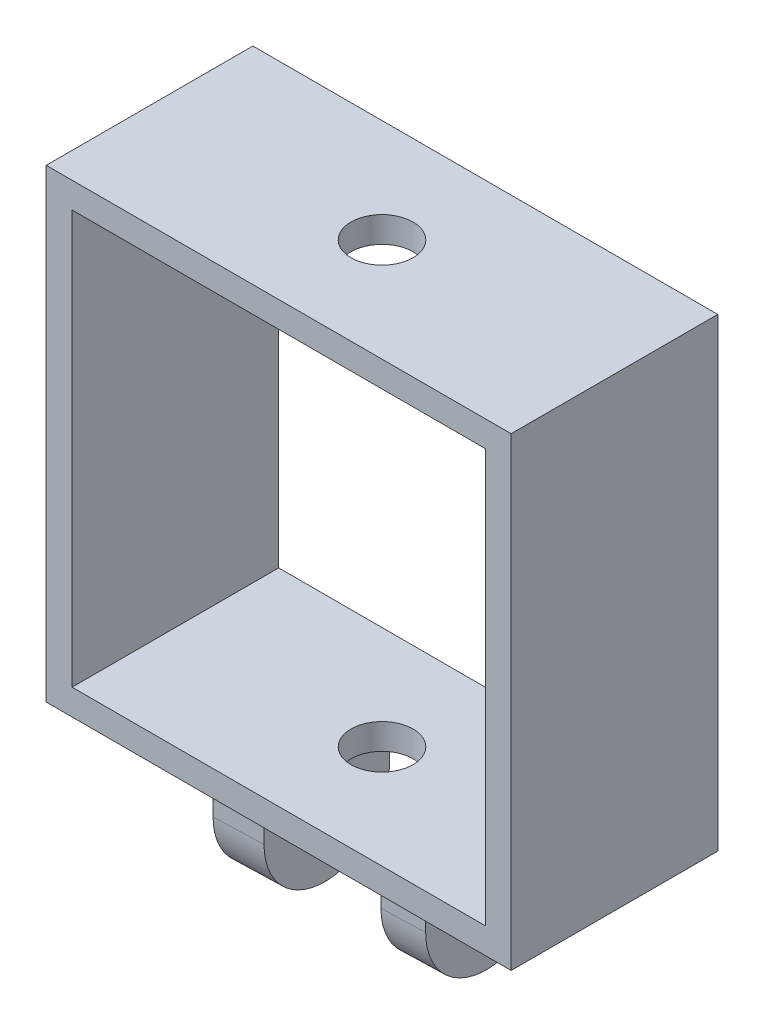
ISO-10303-21;
HEADER;
FILE_DESCRIPTION(('STEP AP214'),'2;1');
FILE_NAME('part.step','',(''),(''),'','','');
FILE_SCHEMA(('AUTOMOTIVE_DESIGN { 1 0 10303 214 1 1 1 1 }'));
ENDSEC;
DATA;
#1=APPLICATION_CONTEXT('core data for automotive mechanical design processes');
#2=APPLICATION_PROTOCOL_DEFINITION('international standard','automotive_design',2000,#1);
#3=PRODUCT_CONTEXT('',#1,'mechanical');
#4=PRODUCT('Part','Part','',(#3));
#5=PRODUCT_RELATED_PRODUCT_CATEGORY('part','',(#4));
#6=PRODUCT_DEFINITION_FORMATION('','',#4);
#7=PRODUCT_DEFINITION_CONTEXT('part definition',#1,'design');
#8=PRODUCT_DEFINITION('design','',#6,#7);
#9=PRODUCT_DEFINITION_SHAPE('','',#8);
#10=(LENGTH_UNIT() NAMED_UNIT(*) SI_UNIT(.MILLI.,.METRE.));
#11=(NAMED_UNIT(*) PLANE_ANGLE_UNIT() SI_UNIT($,.RADIAN.));
#12=(NAMED_UNIT(*) SI_UNIT($,.STERADIAN.) SOLID_ANGLE_UNIT());
#13=UNCERTAINTY_MEASURE_WITH_UNIT(LENGTH_MEASURE(1.E-05),#10,'distance_accuracy_value','');
#14=(GEOMETRIC_REPRESENTATION_CONTEXT(3) GLOBAL_UNCERTAINTY_ASSIGNED_CONTEXT((#13)) GLOBAL_UNIT_ASSIGNED_CONTEXT((#10,
#11,#12)) REPRESENTATION_CONTEXT('',''));
#15=CARTESIAN_POINT('',(0.,0.,0.));
#16=DIRECTION('',(0.,0.,1.));
#17=DIRECTION('',(1.,0.,0.));
#18=AXIS2_PLACEMENT_3D('',#15,#16,#17);
#19=CARTESIAN_POINT('',(-19.9913413596475,-55.,20.5884476544622));
#20=DIRECTION('',(0.999567067982382,0.,-0.0294223827231066));
#21=DIRECTION('',(-0.0294223827231066,0.,-0.999567067982382));
#22=AXIS2_PLACEMENT_3D('',#19,#20,#21);
#23=CYLINDRICAL_SURFACE('',#22,12.5);
#24=CARTESIAN_POINT('',(11.583430644438,-55.,19.6590402579438));
#25=DIRECTION('',(0.999567067982382,0.,-0.0294223827231066));
#26=DIRECTION('',(-0.0294223827231066,0.,-0.999567067982382));
#27=AXIS2_PLACEMENT_3D('',#24,#25,#26);
#28=CIRCLE('',#27,12.5);
#29=CARTESIAN_POINT('',(11.2156508603992,-55.,7.164451908164));
#30=VERTEX_POINT('',#29);
#31=CARTESIAN_POINT('',(11.9512104284768,-55.,32.1536286077235));
#32=VERTEX_POINT('',#31);
#33=EDGE_CURVE('E190',#30,#32,#28,.F.);
#34=ORIENTED_EDGE('',*,*,#33,.F.);
#35=DIRECTION('',(0.999567067982382,0.,-0.0294223827231066));
#36=VECTOR('',#35,1.);
#37=CARTESIAN_POINT('',(-20.3591211436864,-55.,8.0938593046824));
#38=LINE('',#37,#36);
#39=CARTESIAN_POINT('',(19.6235615756089,-55.,6.91696399575814));
#40=VERTEX_POINT('',#39);
#41=EDGE_CURVE('E185',#30,#40,#38,.T.);
#42=ORIENTED_EDGE('',*,*,#41,.T.);
#43=CARTESIAN_POINT('',(19.9913413596477,-55.,19.4115523455379));
#44=DIRECTION('',(0.999567067982382,0.,-0.0294223827231066));
#45=DIRECTION('',(-0.0294223827231066,0.,-0.999567067982382));
#46=AXIS2_PLACEMENT_3D('',#43,#44,#45);
#47=CIRCLE('',#46,12.5);
#48=CARTESIAN_POINT('',(20.3591211436866,-55.,31.9061406953177));
#49=VERTEX_POINT('',#48);
#50=EDGE_CURVE('E274',#49,#40,#47,.T.);
#51=ORIENTED_EDGE('',*,*,#50,.F.);
#52=DIRECTION('',(0.999567067982382,0.,-0.0294223827231066));
#53=VECTOR('',#52,1.);
#54=CARTESIAN_POINT('',(-19.6235615756087,-55.,33.0830360042419));
#55=LINE('',#54,#53);
#56=EDGE_CURVE('E297',#32,#49,#55,.T.);
#57=ORIENTED_EDGE('',*,*,#56,.F.);
#58=EDGE_LOOP('',(#34,#42,#51,#57));
#59=FACE_BOUND('',#58,.T.);
#60=ADVANCED_FACE('F39',(#59),#23,.T.);
#61=CARTESIAN_POINT('',(-19.6235615756087,-45.,33.0830360042419));
#62=DIRECTION('',(0.0294223827231066,0.,0.999567067982382));
#63=DIRECTION('',(0.999567067982382,0.,-0.0294223827231066));
#64=AXIS2_PLACEMENT_3D('',#61,#62,#63);
#65=PLANE('',#64);
#66=DIRECTION('',(0.,1.,0.));
#67=VECTOR('',#66,1.);
#68=CARTESIAN_POINT('',(11.9512104284768,-45.,32.1536286077235));
#69=LINE('',#68,#67);
#70=CARTESIAN_POINT('',(11.9512104284769,-45.,32.1536286077235));
#71=VERTEX_POINT('',#70);
#72=EDGE_CURVE('E269',#32,#71,#69,.T.);
#73=ORIENTED_EDGE('',*,*,#72,.F.);
#74=ORIENTED_EDGE('',*,*,#56,.T.);
#75=DIRECTION('',(0.,-1.,0.));
#76=VECTOR('',#75,1.);
#77=CARTESIAN_POINT('',(20.3591211436866,-45.,31.9061406953177));
#78=LINE('',#77,#76);
#79=CARTESIAN_POINT('',(20.3591211436866,-45.,31.9061406953177));
#80=VERTEX_POINT('',#79);
#81=EDGE_CURVE('E282',#80,#49,#78,.T.);
#82=ORIENTED_EDGE('',*,*,#81,.F.);
#83=DIRECTION('',(0.999567067982382,0.,-0.0294223827231066));
#84=VECTOR('',#83,1.);
#85=CARTESIAN_POINT('',(-19.6235615756087,-45.,33.0830360042419));
#86=LINE('',#85,#84);
#87=EDGE_CURVE('E178',#71,#80,#86,.T.);
#88=ORIENTED_EDGE('',*,*,#87,.F.);
#89=EDGE_LOOP('',(#73,#74,#82,#88));
#90=FACE_BOUND('',#89,.T.);
#91=ADVANCED_FACE('F303',(#90),#65,.T.);
#92=CARTESIAN_POINT('',(-20.3591211436864,-55.,8.0938593046824));
#93=DIRECTION('',(-0.0294223827231066,0.,-0.999567067982382));
#94=DIRECTION('',(-0.999567067982382,0.,0.0294223827231066));
#95=AXIS2_PLACEMENT_3D('',#92,#93,#94);
#96=PLANE('',#95);
#97=DIRECTION('',(0.,-1.,0.));
#98=VECTOR('',#97,1.);
#99=CARTESIAN_POINT('',(11.2156508603992,-45.,7.164451908164));
#100=LINE('',#99,#98);
#101=CARTESIAN_POINT('',(11.2156508603992,-45.,7.164451908164));
#102=VERTEX_POINT('',#101);
#103=EDGE_CURVE('E172',#102,#30,#100,.T.);
#104=ORIENTED_EDGE('',*,*,#103,.F.);
#105=DIRECTION('',(0.999567067982382,0.,-0.0294223827231066));
#106=VECTOR('',#105,1.);
#107=CARTESIAN_POINT('',(-20.3591211436864,-45.,8.0938593046824));
#108=LINE('',#107,#106);
#109=CARTESIAN_POINT('',(19.6235615756089,-45.,6.91696399575814));
#110=VERTEX_POINT('',#109);
#111=EDGE_CURVE('E64',#102,#110,#108,.T.);
#112=ORIENTED_EDGE('',*,*,#111,.T.);
#113=DIRECTION('',(0.,1.,0.));
#114=VECTOR('',#113,1.);
#115=CARTESIAN_POINT('',(19.6235615756089,-55.,6.91696399575814));
#116=LINE('',#115,#114);
#117=EDGE_CURVE('E277',#40,#110,#116,.T.);
#118=ORIENTED_EDGE('',*,*,#117,.F.);
#119=ORIENTED_EDGE('',*,*,#41,.F.);
#120=EDGE_LOOP('',(#104,#112,#118,#119));
#121=FACE_BOUND('',#120,.T.);
#122=ADVANCED_FACE('F313',(#121),#96,.T.);
#123=CARTESIAN_POINT('',(-19.9913413596475,-55.,20.5884476544622));
#124=DIRECTION('',(0.999567067982382,0.,-0.0294223827231066));
#125=DIRECTION('',(-0.0294223827231066,0.,-0.999567067982382));
#126=AXIS2_PLACEMENT_3D('',#123,#124,#125);
#127=CYLINDRICAL_SURFACE('',#126,4.00000000000001);
#128=CARTESIAN_POINT('',(11.583430644438,-55.,19.6590402579438));
#129=DIRECTION('',(0.999567067982382,0.,-0.0294223827231066));
#130=DIRECTION('',(-0.0294223827231066,0.,-0.999567067982382));
#131=AXIS2_PLACEMENT_3D('',#128,#129,#130);
#132=CIRCLE('',#131,4.00000000000001);
#133=CARTESIAN_POINT('',(11.4657411135456,-55.,15.6607719860142));
#134=VERTEX_POINT('',#133);
#135=EDGE_CURVE('E43',#134,#134,#132,.F.);
#136=ORIENTED_EDGE('',*,*,#135,.T.);
#137=EDGE_LOOP('',(#136));
#138=FACE_BOUND('',#137,.T.);
#139=CARTESIAN_POINT('',(19.9913413596477,-55.,19.4115523455379));
#140=DIRECTION('',(0.999567067982382,0.,-0.0294223827231066));
#141=DIRECTION('',(-0.0294223827231066,0.,-0.999567067982382));
#142=AXIS2_PLACEMENT_3D('',#139,#140,#141);
#143=CIRCLE('',#142,4.00000000000001);
#144=CARTESIAN_POINT('',(19.8736518287553,-55.,15.4132840736084));
#145=VERTEX_POINT('',#144);
#146=EDGE_CURVE('E189',#145,#145,#143,.T.);
#147=ORIENTED_EDGE('',*,*,#146,.T.);
#148=EDGE_LOOP('',(#147));
#149=FACE_BOUND('',#148,.T.);
#150=ADVANCED_FACE('F318',(#138,#149),#127,.F.);
#151=CARTESIAN_POINT('',(-45.,-45.,40.));
#152=DIRECTION('',(0.,1.,0.));
#153=DIRECTION('',(0.,0.,1.));
#154=AXIS2_PLACEMENT_3D('',#151,#152,#153);
#155=PLANE('',#154);
#156=DIRECTION('',(-0.0294223827231066,0.,-0.999567067982382));
#157=VECTOR('',#156,1.);
#158=CARTESIAN_POINT('',(12.2105789882996,-45.,40.9651607432632));
#159=LINE('',#158,#157);
#160=EDGE_CURVE('E165',#71,#102,#159,.T.);
#161=ORIENTED_EDGE('',*,*,#160,.F.);
#162=ORIENTED_EDGE('',*,*,#87,.T.);
#163=DIRECTION('',(0.0294223827231066,0.,0.999567067982382));
#164=VECTOR('',#163,1.);
#165=CARTESIAN_POINT('',(19.6235615756089,-45.,6.91696399575814));
#166=LINE('',#165,#164);
#167=EDGE_CURVE('E279',#110,#80,#166,.T.);
#168=ORIENTED_EDGE('',*,*,#167,.F.);
#169=ORIENTED_EDGE('',*,*,#111,.F.);
#170=EDGE_LOOP('',(#161,#162,#168,#169));
#171=FACE_BOUND('',#170,.T.);
#172=DIRECTION('',(0.,0.,-1.));
#173=VECTOR('',#172,1.);
#174=CARTESIAN_POINT('',(45.,-45.,40.));
#175=LINE('',#174,#173);
#176=CARTESIAN_POINT('',(45.,-45.,40.));
#177=VERTEX_POINT('',#176);
#178=CARTESIAN_POINT('',(45.,-45.,0.));
#179=VERTEX_POINT('',#178);
#180=EDGE_CURVE('E241',#177,#179,#175,.T.);
#181=ORIENTED_EDGE('',*,*,#180,.F.);
#182=DIRECTION('',(1.,0.,0.));
#183=VECTOR('',#182,1.);
#184=CARTESIAN_POINT('',(-45.,-45.,40.));
#185=LINE('',#184,#183);
#186=CARTESIAN_POINT('',(-45.,-45.,40.));
#187=VERTEX_POINT('',#186);
#188=EDGE_CURVE('E239',#187,#177,#185,.T.);
#189=ORIENTED_EDGE('',*,*,#188,.F.);
#190=DIRECTION('',(0.,0.,-1.));
#191=VECTOR('',#190,1.);
#192=CARTESIAN_POINT('',(-45.,-45.,40.));
#193=LINE('',#192,#191);
#194=CARTESIAN_POINT('',(-45.,-45.,0.));
#195=VERTEX_POINT('',#194);
#196=EDGE_CURVE('E251',#187,#195,#193,.T.);
#197=ORIENTED_EDGE('',*,*,#196,.T.);
#198=DIRECTION('',(1.,0.,0.));
#199=VECTOR('',#198,1.);
#200=CARTESIAN_POINT('',(-45.,-45.,0.));
#201=LINE('',#200,#199);
#202=EDGE_CURVE('E235',#195,#179,#201,.T.);
#203=ORIENTED_EDGE('',*,*,#202,.T.);
#204=EDGE_LOOP('',(#181,#189,#197,#203));
#205=FACE_BOUND('',#204,.T.);
#206=CARTESIAN_POINT('',(-19.6235615756087,-45.,33.0830360042419));
#207=VERTEX_POINT('',#206);
#208=CARTESIAN_POINT('',(-10.0392650671355,-45.,32.8009210276319));
#209=VERTEX_POINT('',#208);
#210=EDGE_CURVE('E163',#207,#209,#86,.T.);
#211=ORIENTED_EDGE('',*,*,#210,.T.);
#212=DIRECTION('',(-0.0294223827231066,0.,-0.999567067982382));
#213=VECTOR('',#212,1.);
#214=CARTESIAN_POINT('',(-9.77989650731283,-45.,41.6124531631716));
#215=LINE('',#214,#213);
#216=CARTESIAN_POINT('',(-10.7748246352132,-45.,7.81174432807235));
#217=VERTEX_POINT('',#216);
#218=EDGE_CURVE('E157',#209,#217,#215,.T.);
#219=ORIENTED_EDGE('',*,*,#218,.T.);
#220=CARTESIAN_POINT('',(-20.3591211436864,-45.,8.0938593046824));
#221=VERTEX_POINT('',#220);
#222=EDGE_CURVE('E162',#221,#217,#108,.T.);
#223=ORIENTED_EDGE('',*,*,#222,.F.);
#224=DIRECTION('',(0.0294223827231066,0.,0.999567067982382));
#225=VECTOR('',#224,1.);
#226=CARTESIAN_POINT('',(-20.3591211436864,-45.,8.0938593046824));
#227=LINE('',#226,#225);
#228=EDGE_CURVE('E292',#221,#207,#227,.T.);
#229=ORIENTED_EDGE('',*,*,#228,.T.);
#230=EDGE_LOOP('',(#211,#219,#223,#229));
#231=FACE_BOUND('',#230,.T.);
#232=CARTESIAN_POINT('',(0.,-45.,20.));
#233=DIRECTION('',(0.,1.,0.));
#234=DIRECTION('',(0.,0.,1.));
#235=AXIS2_PLACEMENT_3D('',#232,#233,#234);
#236=CIRCLE('',#235,6.);
#237=CARTESIAN_POINT('',(0.,-45.,26.));
#238=VERTEX_POINT('',#237);
#239=EDGE_CURVE('E186',#238,#238,#236,.T.);
#240=ORIENTED_EDGE('',*,*,#239,.T.);
#241=EDGE_LOOP('',(#240));
#242=FACE_BOUND('',#241,.T.);
#243=ADVANCED_FACE('F158',(#171,#205,#231,#242),#155,.F.);
#244=CARTESIAN_POINT('',(0.,0.,40.));
#245=DIRECTION('',(0.,0.,-1.));
#246=DIRECTION('',(-1.,0.,0.));
#247=AXIS2_PLACEMENT_3D('',#244,#245,#246);
#248=PLANE('',#247);
#249=DIRECTION('',(0.,1.,0.));
#250=VECTOR('',#249,1.);
#251=CARTESIAN_POINT('',(45.,-45.,40.));
#252=LINE('',#251,#250);
#253=CARTESIAN_POINT('',(45.,45.,40.));
#254=VERTEX_POINT('',#253);
#255=EDGE_CURVE('E231',#177,#254,#252,.T.);
#256=ORIENTED_EDGE('',*,*,#255,.T.);
#257=DIRECTION('',(-1.,0.,0.));
#258=VECTOR('',#257,1.);
#259=CARTESIAN_POINT('',(-45.,45.,40.));
#260=LINE('',#259,#258);
#261=CARTESIAN_POINT('',(-45.,45.,40.));
#262=VERTEX_POINT('',#261);
#263=EDGE_CURVE('E234',#254,#262,#260,.T.);
#264=ORIENTED_EDGE('',*,*,#263,.T.);
#265=DIRECTION('',(0.,-1.,0.));
#266=VECTOR('',#265,1.);
#267=CARTESIAN_POINT('',(-45.,-45.,40.));
#268=LINE('',#267,#266);
#269=EDGE_CURVE('E237',#262,#187,#268,.T.);
#270=ORIENTED_EDGE('',*,*,#269,.T.);
#271=ORIENTED_EDGE('',*,*,#188,.T.);
#272=EDGE_LOOP('',(#256,#264,#270,#271));
#273=FACE_BOUND('',#272,.T.);
#274=DIRECTION('',(0.,1.,0.));
#275=VECTOR('',#274,1.);
#276=CARTESIAN_POINT('',(40.,-40.,40.));
#277=LINE('',#276,#275);
#278=CARTESIAN_POINT('',(40.,-40.,40.));
#279=VERTEX_POINT('',#278);
#280=CARTESIAN_POINT('',(40.,40.,40.));
#281=VERTEX_POINT('',#280);
#282=EDGE_CURVE('E200',#279,#281,#277,.T.);
#283=ORIENTED_EDGE('',*,*,#282,.F.);
#284=DIRECTION('',(1.,0.,0.));
#285=VECTOR('',#284,1.);
#286=CARTESIAN_POINT('',(-40.,-40.,40.));
#287=LINE('',#286,#285);
#288=CARTESIAN_POINT('',(-40.,-40.,40.));
#289=VERTEX_POINT('',#288);
#290=EDGE_CURVE('E208',#289,#279,#287,.T.);
#291=ORIENTED_EDGE('',*,*,#290,.F.);
#292=DIRECTION('',(0.,-1.,0.));
#293=VECTOR('',#292,1.);
#294=CARTESIAN_POINT('',(-40.,-40.,40.));
#295=LINE('',#294,#293);
#296=CARTESIAN_POINT('',(-40.,40.,40.));
#297=VERTEX_POINT('',#296);
#298=EDGE_CURVE('E205',#297,#289,#295,.T.);
#299=ORIENTED_EDGE('',*,*,#298,.F.);
#300=DIRECTION('',(-1.,0.,0.));
#301=VECTOR('',#300,1.);
#302=CARTESIAN_POINT('',(-40.,40.,40.));
#303=LINE('',#302,#301);
#304=EDGE_CURVE('E202',#281,#297,#303,.T.);
#305=ORIENTED_EDGE('',*,*,#304,.F.);
#306=EDGE_LOOP('',(#283,#291,#299,#305));
#307=FACE_BOUND('',#306,.T.);
#308=ADVANCED_FACE('F317',(#273,#307),#248,.F.);
#309=CARTESIAN_POINT('',(0.,0.,0.));
#310=DIRECTION('',(0.,0.,-1.));
#311=DIRECTION('',(-1.,0.,0.));
#312=AXIS2_PLACEMENT_3D('',#309,#310,#311);
#313=PLANE('',#312);
#314=DIRECTION('',(0.,1.,0.));
#315=VECTOR('',#314,1.);
#316=CARTESIAN_POINT('',(45.,-45.,0.));
#317=LINE('',#316,#315);
#318=CARTESIAN_POINT('',(45.,45.,0.));
#319=VERTEX_POINT('',#318);
#320=EDGE_CURVE('E230',#179,#319,#317,.T.);
#321=ORIENTED_EDGE('',*,*,#320,.F.);
#322=ORIENTED_EDGE('',*,*,#202,.F.);
#323=DIRECTION('',(0.,-1.,0.));
#324=VECTOR('',#323,1.);
#325=CARTESIAN_POINT('',(-45.,-45.,0.));
#326=LINE('',#325,#324);
#327=CARTESIAN_POINT('',(-45.,45.,0.));
#328=VERTEX_POINT('',#327);
#329=EDGE_CURVE('E246',#328,#195,#326,.T.);
#330=ORIENTED_EDGE('',*,*,#329,.F.);
#331=DIRECTION('',(-1.,0.,0.));
#332=VECTOR('',#331,1.);
#333=CARTESIAN_POINT('',(-45.,45.,0.));
#334=LINE('',#333,#332);
#335=EDGE_CURVE('E244',#319,#328,#334,.T.);
#336=ORIENTED_EDGE('',*,*,#335,.F.);
#337=EDGE_LOOP('',(#321,#322,#330,#336));
#338=FACE_BOUND('',#337,.T.);
#339=DIRECTION('',(1.,0.,0.));
#340=VECTOR('',#339,1.);
#341=CARTESIAN_POINT('',(-40.,-40.,0.));
#342=LINE('',#341,#340);
#343=CARTESIAN_POINT('',(-40.,-40.,0.));
#344=VERTEX_POINT('',#343);
#345=CARTESIAN_POINT('',(40.,-40.,0.));
#346=VERTEX_POINT('',#345);
#347=EDGE_CURVE('E203',#344,#346,#342,.T.);
#348=ORIENTED_EDGE('',*,*,#347,.T.);
#349=DIRECTION('',(0.,1.,0.));
#350=VECTOR('',#349,1.);
#351=CARTESIAN_POINT('',(40.,-40.,0.));
#352=LINE('',#351,#350);
#353=CARTESIAN_POINT('',(40.,40.,0.));
#354=VERTEX_POINT('',#353);
#355=EDGE_CURVE('E199',#346,#354,#352,.T.);
#356=ORIENTED_EDGE('',*,*,#355,.T.);
#357=DIRECTION('',(-1.,0.,0.));
#358=VECTOR('',#357,1.);
#359=CARTESIAN_POINT('',(-40.,40.,0.));
#360=LINE('',#359,#358);
#361=CARTESIAN_POINT('',(-40.,40.,0.));
#362=VERTEX_POINT('',#361);
#363=EDGE_CURVE('E213',#354,#362,#360,.T.);
#364=ORIENTED_EDGE('',*,*,#363,.T.);
#365=DIRECTION('',(0.,-1.,0.));
#366=VECTOR('',#365,1.);
#367=CARTESIAN_POINT('',(-40.,-40.,0.));
#368=LINE('',#367,#366);
#369=EDGE_CURVE('E216',#362,#344,#368,.T.);
#370=ORIENTED_EDGE('',*,*,#369,.T.);
#371=EDGE_LOOP('',(#348,#356,#364,#370));
#372=FACE_BOUND('',#371,.T.);
#373=ADVANCED_FACE('F336',(#338,#372),#313,.T.);
#374=CARTESIAN_POINT('',(45.,-45.,40.));
#375=DIRECTION('',(-1.,0.,0.));
#376=DIRECTION('',(0.,0.,1.));
#377=AXIS2_PLACEMENT_3D('',#374,#375,#376);
#378=PLANE('',#377);
#379=ORIENTED_EDGE('',*,*,#320,.T.);
#380=DIRECTION('',(0.,0.,-1.));
#381=VECTOR('',#380,1.);
#382=CARTESIAN_POINT('',(45.,45.,40.));
#383=LINE('',#382,#381);
#384=EDGE_CURVE('E11',#254,#319,#383,.T.);
#385=ORIENTED_EDGE('',*,*,#384,.F.);
#386=ORIENTED_EDGE('',*,*,#255,.F.);
#387=ORIENTED_EDGE('',*,*,#180,.T.);
#388=EDGE_LOOP('',(#379,#385,#386,#387));
#389=FACE_BOUND('',#388,.T.);
#390=ADVANCED_FACE('F41',(#389),#378,.F.);
#391=CARTESIAN_POINT('',(-45.,45.,40.));
#392=DIRECTION('',(0.,-1.,0.));
#393=DIRECTION('',(0.,0.,-1.));
#394=AXIS2_PLACEMENT_3D('',#391,#392,#393);
#395=PLANE('',#394);
#396=CARTESIAN_POINT('',(0.,45.,20.));
#397=DIRECTION('',(0.,1.,0.));
#398=DIRECTION('',(0.,0.,1.));
#399=AXIS2_PLACEMENT_3D('',#396,#397,#398);
#400=CIRCLE('',#399,6.);
#401=CARTESIAN_POINT('',(0.,45.,26.));
#402=VERTEX_POINT('',#401);
#403=EDGE_CURVE('E191',#402,#402,#400,.T.);
#404=ORIENTED_EDGE('',*,*,#403,.F.);
#405=EDGE_LOOP('',(#404));
#406=FACE_BOUND('',#405,.T.);
#407=ORIENTED_EDGE('',*,*,#335,.T.);
#408=DIRECTION('',(0.,0.,-1.));
#409=VECTOR('',#408,1.);
#410=CARTESIAN_POINT('',(-45.,45.,40.));
#411=LINE('',#410,#409);
#412=EDGE_CURVE('E48',#262,#328,#411,.T.);
#413=ORIENTED_EDGE('',*,*,#412,.F.);
#414=ORIENTED_EDGE('',*,*,#263,.F.);
#415=ORIENTED_EDGE('',*,*,#384,.T.);
#416=EDGE_LOOP('',(#407,#413,#414,#415));
#417=FACE_BOUND('',#416,.T.);
#418=ADVANCED_FACE('F339',(#406,#417),#395,.F.);
#419=CARTESIAN_POINT('',(-45.,-45.,40.));
#420=DIRECTION('',(1.,0.,0.));
#421=DIRECTION('',(0.,0.,-1.));
#422=AXIS2_PLACEMENT_3D('',#419,#420,#421);
#423=PLANE('',#422);
#424=ORIENTED_EDGE('',*,*,#329,.T.);
#425=ORIENTED_EDGE('',*,*,#196,.F.);
#426=ORIENTED_EDGE('',*,*,#269,.F.);
#427=ORIENTED_EDGE('',*,*,#412,.T.);
#428=EDGE_LOOP('',(#424,#425,#426,#427));
#429=FACE_BOUND('',#428,.T.);
#430=ADVANCED_FACE('F333',(#429),#423,.F.);
#431=CARTESIAN_POINT('',(40.,-40.,40.));
#432=DIRECTION('',(-1.,0.,0.));
#433=DIRECTION('',(0.,0.,1.));
#434=AXIS2_PLACEMENT_3D('',#431,#432,#433);
#435=PLANE('',#434);
#436=ORIENTED_EDGE('',*,*,#355,.F.);
#437=DIRECTION('',(0.,0.,-1.));
#438=VECTOR('',#437,1.);
#439=CARTESIAN_POINT('',(40.,-40.,40.));
#440=LINE('',#439,#438);
#441=EDGE_CURVE('E210',#279,#346,#440,.T.);
#442=ORIENTED_EDGE('',*,*,#441,.F.);
#443=ORIENTED_EDGE('',*,*,#282,.T.);
#444=DIRECTION('',(0.,0.,-1.));
#445=VECTOR('',#444,1.);
#446=CARTESIAN_POINT('',(40.,40.,40.));
#447=LINE('',#446,#445);
#448=EDGE_CURVE('E227',#281,#354,#447,.T.);
#449=ORIENTED_EDGE('',*,*,#448,.T.);
#450=EDGE_LOOP('',(#436,#442,#443,#449));
#451=FACE_BOUND('',#450,.T.);
#452=ADVANCED_FACE('F346',(#451),#435,.T.);
#453=CARTESIAN_POINT('',(-40.,40.,40.));
#454=DIRECTION('',(0.,-1.,0.));
#455=DIRECTION('',(0.,0.,-1.));
#456=AXIS2_PLACEMENT_3D('',#453,#454,#455);
#457=PLANE('',#456);
#458=CARTESIAN_POINT('',(0.,40.,20.));
#459=DIRECTION('',(0.,-1.,0.));
#460=DIRECTION('',(0.,0.,-1.));
#461=AXIS2_PLACEMENT_3D('',#458,#459,#460);
#462=CIRCLE('',#461,6.);
#463=CARTESIAN_POINT('',(0.,40.,26.));
#464=VERTEX_POINT('',#463);
#465=EDGE_CURVE('E196',#464,#464,#462,.T.);
#466=ORIENTED_EDGE('',*,*,#465,.F.);
#467=EDGE_LOOP('',(#466));
#468=FACE_BOUND('',#467,.T.);
#469=ORIENTED_EDGE('',*,*,#363,.F.);
#470=ORIENTED_EDGE('',*,*,#448,.F.);
#471=ORIENTED_EDGE('',*,*,#304,.T.);
#472=DIRECTION('',(0.,0.,-1.));
#473=VECTOR('',#472,1.);
#474=CARTESIAN_POINT('',(-40.,40.,40.));
#475=LINE('',#474,#473);
#476=EDGE_CURVE('E225',#297,#362,#475,.T.);
#477=ORIENTED_EDGE('',*,*,#476,.T.);
#478=EDGE_LOOP('',(#469,#470,#471,#477));
#479=FACE_BOUND('',#478,.T.);
#480=ADVANCED_FACE('F504',(#468,#479),#457,.T.);
#481=CARTESIAN_POINT('',(-40.,-40.,40.));
#482=DIRECTION('',(1.,0.,0.));
#483=DIRECTION('',(0.,0.,-1.));
#484=AXIS2_PLACEMENT_3D('',#481,#482,#483);
#485=PLANE('',#484);
#486=ORIENTED_EDGE('',*,*,#369,.F.);
#487=ORIENTED_EDGE('',*,*,#476,.F.);
#488=ORIENTED_EDGE('',*,*,#298,.T.);
#489=DIRECTION('',(0.,0.,-1.));
#490=VECTOR('',#489,1.);
#491=CARTESIAN_POINT('',(-40.,-40.,40.));
#492=LINE('',#491,#490);
#493=EDGE_CURVE('E223',#289,#344,#492,.T.);
#494=ORIENTED_EDGE('',*,*,#493,.T.);
#495=EDGE_LOOP('',(#486,#487,#488,#494));
#496=FACE_BOUND('',#495,.T.);
#497=ADVANCED_FACE('F494',(#496),#485,.T.);
#498=CARTESIAN_POINT('',(-40.,-40.,40.));
#499=DIRECTION('',(0.,1.,0.));
#500=DIRECTION('',(0.,0.,1.));
#501=AXIS2_PLACEMENT_3D('',#498,#499,#500);
#502=PLANE('',#501);
#503=CARTESIAN_POINT('',(0.,-40.,20.));
#504=DIRECTION('',(0.,1.,0.));
#505=DIRECTION('',(0.,0.,1.));
#506=AXIS2_PLACEMENT_3D('',#503,#504,#505);
#507=CIRCLE('',#506,6.);
#508=CARTESIAN_POINT('',(0.,-40.,26.));
#509=VERTEX_POINT('',#508);
#510=EDGE_CURVE('E194',#509,#509,#507,.T.);
#511=ORIENTED_EDGE('',*,*,#510,.F.);
#512=EDGE_LOOP('',(#511));
#513=FACE_BOUND('',#512,.T.);
#514=ORIENTED_EDGE('',*,*,#347,.F.);
#515=ORIENTED_EDGE('',*,*,#493,.F.);
#516=ORIENTED_EDGE('',*,*,#290,.T.);
#517=ORIENTED_EDGE('',*,*,#441,.T.);
#518=EDGE_LOOP('',(#514,#515,#516,#517));
#519=FACE_BOUND('',#518,.T.);
#520=ADVANCED_FACE('F486',(#513,#519),#502,.T.);
#521=CARTESIAN_POINT('',(0.,-45.,20.));
#522=DIRECTION('',(0.,1.,0.));
#523=DIRECTION('',(0.,0.,1.));
#524=AXIS2_PLACEMENT_3D('',#521,#522,#523);
#525=CYLINDRICAL_SURFACE('',#524,6.);
#526=CARTESIAN_POINT('',(0.,-40.,26.));
#527=CARTESIAN_POINT('',(0.,-40.0520833333333,26.));
#528=CARTESIAN_POINT('',(0.,-40.1041666666667,26.));
#529=CARTESIAN_POINT('',(0.,-40.2083333333333,26.));
#530=CARTESIAN_POINT('',(0.,-40.2604166666667,26.));
#531=CARTESIAN_POINT('',(0.,-40.3645833333333,26.));
#532=CARTESIAN_POINT('',(0.,-40.4166666666667,26.));
#533=CARTESIAN_POINT('',(0.,-40.5208333333333,26.));
#534=CARTESIAN_POINT('',(0.,-40.5729166666667,26.));
#535=CARTESIAN_POINT('',(0.,-40.6770833333333,26.));
#536=CARTESIAN_POINT('',(0.,-40.7291666666667,26.));
#537=CARTESIAN_POINT('',(0.,-40.8333333333333,26.));
#538=CARTESIAN_POINT('',(0.,-40.8854166666667,26.));
#539=CARTESIAN_POINT('',(0.,-40.9895833333333,26.));
#540=CARTESIAN_POINT('',(0.,-41.0416666666667,26.));
#541=CARTESIAN_POINT('',(0.,-41.1458333333333,26.));
#542=CARTESIAN_POINT('',(0.,-41.1979166666667,26.));
#543=CARTESIAN_POINT('',(0.,-41.3020833333333,26.));
#544=CARTESIAN_POINT('',(0.,-41.3541666666667,26.));
#545=CARTESIAN_POINT('',(0.,-41.4583333333333,26.));
#546=CARTESIAN_POINT('',(0.,-41.5104166666667,26.));
#547=CARTESIAN_POINT('',(0.,-41.6145833333333,26.));
#548=CARTESIAN_POINT('',(0.,-41.6666666666667,26.));
#549=CARTESIAN_POINT('',(0.,-41.7708333333333,26.));
#550=CARTESIAN_POINT('',(0.,-41.8229166666667,26.));
#551=CARTESIAN_POINT('',(0.,-41.9270833333333,26.));
#552=CARTESIAN_POINT('',(0.,-41.9791666666667,26.));
#553=CARTESIAN_POINT('',(0.,-42.0833333333333,26.));
#554=CARTESIAN_POINT('',(0.,-42.1354166666667,26.));
#555=CARTESIAN_POINT('',(0.,-42.2395833333333,26.));
#556=CARTESIAN_POINT('',(0.,-42.2916666666667,26.));
#557=CARTESIAN_POINT('',(0.,-42.3958333333333,26.));
#558=CARTESIAN_POINT('',(0.,-42.4479166666667,26.));
#559=CARTESIAN_POINT('',(0.,-42.5520833333333,26.));
#560=CARTESIAN_POINT('',(0.,-42.6041666666667,26.));
#561=CARTESIAN_POINT('',(0.,-42.7083333333333,26.));
#562=CARTESIAN_POINT('',(0.,-42.7604166666667,26.));
#563=CARTESIAN_POINT('',(0.,-42.8645833333333,26.));
#564=CARTESIAN_POINT('',(0.,-42.9166666666667,26.));
#565=CARTESIAN_POINT('',(0.,-43.0208333333333,26.));
#566=CARTESIAN_POINT('',(0.,-43.0729166666667,26.));
#567=CARTESIAN_POINT('',(0.,-43.1770833333333,26.));
#568=CARTESIAN_POINT('',(0.,-43.2291666666667,26.));
#569=CARTESIAN_POINT('',(0.,-43.3333333333333,26.));
#570=CARTESIAN_POINT('',(0.,-43.3854166666667,26.));
#571=CARTESIAN_POINT('',(0.,-43.4895833333333,26.));
#572=CARTESIAN_POINT('',(0.,-43.5416666666667,26.));
#573=CARTESIAN_POINT('',(0.,-43.6458333333333,26.));
#574=CARTESIAN_POINT('',(0.,-43.6979166666667,26.));
#575=CARTESIAN_POINT('',(0.,-43.8020833333333,26.));
#576=CARTESIAN_POINT('',(0.,-43.8541666666667,26.));
#577=CARTESIAN_POINT('',(0.,-43.9583333333333,26.));
#578=CARTESIAN_POINT('',(0.,-44.0104166666667,26.));
#579=CARTESIAN_POINT('',(0.,-44.1145833333333,26.));
#580=CARTESIAN_POINT('',(0.,-44.1666666666667,26.));
#581=CARTESIAN_POINT('',(0.,-44.2708333333333,26.));
#582=CARTESIAN_POINT('',(0.,-44.3229166666667,26.));
#583=CARTESIAN_POINT('',(0.,-44.4270833333333,26.));
#584=CARTESIAN_POINT('',(0.,-44.4791666666667,26.));
#585=CARTESIAN_POINT('',(0.,-44.5833333333333,26.));
#586=CARTESIAN_POINT('',(0.,-44.6354166666667,26.));
#587=CARTESIAN_POINT('',(0.,-44.7395833333333,26.));
#588=CARTESIAN_POINT('',(0.,-44.7916666666667,26.));
#589=CARTESIAN_POINT('',(0.,-44.8958333333333,26.));
#590=CARTESIAN_POINT('',(0.,-44.9479166666667,26.));
#591=CARTESIAN_POINT('',(0.,-45.,26.));
#592=B_SPLINE_CURVE_WITH_KNOTS('',3,(#526,#527,#528,#529,#530,#531,#532,#533,#534,#535,#536,
#537,#538,#539,#540,#541,#542,#543,#544,#545,#546,#547,#548,#549,#550,#551,#552,#553,#554,#555,
#556,#557,#558,#559,#560,#561,#562,#563,#564,#565,#566,#567,#568,#569,#570,#571,#572,#573,#574,
#575,#576,#577,#578,#579,#580,#581,#582,#583,#584,#585,#586,#587,#588,#589,#590,#591),
.UNSPECIFIED.,.F.,.F.,(4,2,2,2,2,2,2,2,2,2,2,2,2,2,2,2,2,2,2,2,2,2,2,2,2,2,2,2,2,2,2,2,4),(0.,
0.156249999999997,0.3125,0.468749999999997,0.624999999999994,0.781249999999997,
0.937499999999994,1.09375,1.24999999999999,1.40625,1.56249999999999,1.71875,1.87499999999999,
2.03125,2.1875,2.34375,2.5,2.65625,2.8125,2.96874999999999,3.125,3.28124999999999,3.4375,
3.59374999999999,3.75,3.90624999999999,4.0625,4.21874999999999,4.375,4.53124999999999,4.6875,
4.84374999999999,4.99999999999999),.UNSPECIFIED.);
#593=EDGE_CURVE('BSEAM366',#509,#238,#592,.T.);
#594=ORIENTED_EDGE('',*,*,#510,.T.);
#595=ORIENTED_EDGE('',*,*,#239,.F.);
#596=ORIENTED_EDGE('',*,*,#593,.T.);
#597=ORIENTED_EDGE('',*,*,#593,.F.);
#598=EDGE_LOOP('',(#594,#596,#595,#597));
#599=FACE_BOUND('',#598,.T.);
#600=ADVANCED_FACE('F366',(#599),#525,.F.);
#601=CARTESIAN_POINT('',(0.,40.,26.));
#602=CARTESIAN_POINT('',(0.,40.0520833333333,26.));
#603=CARTESIAN_POINT('',(0.,40.1041666666667,26.));
#604=CARTESIAN_POINT('',(0.,40.2083333333333,26.));
#605=CARTESIAN_POINT('',(0.,40.2604166666667,26.));
#606=CARTESIAN_POINT('',(0.,40.3645833333333,26.));
#607=CARTESIAN_POINT('',(0.,40.4166666666667,26.));
#608=CARTESIAN_POINT('',(0.,40.5208333333333,26.));
#609=CARTESIAN_POINT('',(0.,40.5729166666667,26.));
#610=CARTESIAN_POINT('',(0.,40.6770833333333,26.));
#611=CARTESIAN_POINT('',(0.,40.7291666666667,26.));
#612=CARTESIAN_POINT('',(0.,40.8333333333333,26.));
#613=CARTESIAN_POINT('',(0.,40.8854166666667,26.));
#614=CARTESIAN_POINT('',(0.,40.9895833333333,26.));
#615=CARTESIAN_POINT('',(0.,41.0416666666667,26.));
#616=CARTESIAN_POINT('',(0.,41.1458333333333,26.));
#617=CARTESIAN_POINT('',(0.,41.1979166666667,26.));
#618=CARTESIAN_POINT('',(0.,41.3020833333333,26.));
#619=CARTESIAN_POINT('',(0.,41.3541666666667,26.));
#620=CARTESIAN_POINT('',(0.,41.4583333333333,26.));
#621=CARTESIAN_POINT('',(0.,41.5104166666667,26.));
#622=CARTESIAN_POINT('',(0.,41.6145833333333,26.));
#623=CARTESIAN_POINT('',(0.,41.6666666666667,26.));
#624=CARTESIAN_POINT('',(0.,41.7708333333333,26.));
#625=CARTESIAN_POINT('',(0.,41.8229166666667,26.));
#626=CARTESIAN_POINT('',(0.,41.9270833333333,26.));
#627=CARTESIAN_POINT('',(0.,41.9791666666667,26.));
#628=CARTESIAN_POINT('',(0.,42.0833333333333,26.));
#629=CARTESIAN_POINT('',(0.,42.1354166666667,26.));
#630=CARTESIAN_POINT('',(0.,42.2395833333333,26.));
#631=CARTESIAN_POINT('',(0.,42.2916666666667,26.));
#632=CARTESIAN_POINT('',(0.,42.3958333333333,26.));
#633=CARTESIAN_POINT('',(0.,42.4479166666667,26.));
#634=CARTESIAN_POINT('',(0.,42.5520833333333,26.));
#635=CARTESIAN_POINT('',(0.,42.6041666666667,26.));
#636=CARTESIAN_POINT('',(0.,42.7083333333333,26.));
#637=CARTESIAN_POINT('',(0.,42.7604166666667,26.));
#638=CARTESIAN_POINT('',(0.,42.8645833333333,26.));
#639=CARTESIAN_POINT('',(0.,42.9166666666667,26.));
#640=CARTESIAN_POINT('',(0.,43.0208333333333,26.));
#641=CARTESIAN_POINT('',(0.,43.0729166666667,26.));
#642=CARTESIAN_POINT('',(0.,43.1770833333333,26.));
#643=CARTESIAN_POINT('',(0.,43.2291666666667,26.));
#644=CARTESIAN_POINT('',(0.,43.3333333333333,26.));
#645=CARTESIAN_POINT('',(0.,43.3854166666667,26.));
#646=CARTESIAN_POINT('',(0.,43.4895833333333,26.));
#647=CARTESIAN_POINT('',(0.,43.5416666666666,26.));
#648=CARTESIAN_POINT('',(0.,43.6458333333333,26.));
#649=CARTESIAN_POINT('',(0.,43.6979166666666,26.));
#650=CARTESIAN_POINT('',(0.,43.8020833333333,26.));
#651=CARTESIAN_POINT('',(0.,43.8541666666667,26.));
#652=CARTESIAN_POINT('',(0.,43.9583333333333,26.));
#653=CARTESIAN_POINT('',(0.,44.0104166666667,26.));
#654=CARTESIAN_POINT('',(0.,44.1145833333333,26.));
#655=CARTESIAN_POINT('',(0.,44.1666666666666,26.));
#656=CARTESIAN_POINT('',(0.,44.2708333333333,26.));
#657=CARTESIAN_POINT('',(0.,44.3229166666666,26.));
#658=CARTESIAN_POINT('',(0.,44.4270833333333,26.));
#659=CARTESIAN_POINT('',(0.,44.4791666666666,26.));
#660=CARTESIAN_POINT('',(0.,44.5833333333333,26.));
#661=CARTESIAN_POINT('',(0.,44.6354166666667,26.));
#662=CARTESIAN_POINT('',(0.,44.7395833333333,26.));
#663=CARTESIAN_POINT('',(0.,44.7916666666666,26.));
#664=CARTESIAN_POINT('',(0.,44.8958333333333,26.));
#665=CARTESIAN_POINT('',(0.,44.9479166666666,26.));
#666=CARTESIAN_POINT('',(0.,45.,26.));
#667=B_SPLINE_CURVE_WITH_KNOTS('',3,(#601,#602,#603,#604,#605,#606,#607,#608,#609,#610,#611,
#612,#613,#614,#615,#616,#617,#618,#619,#620,#621,#622,#623,#624,#625,#626,#627,#628,#629,#630,
#631,#632,#633,#634,#635,#636,#637,#638,#639,#640,#641,#642,#643,#644,#645,#646,#647,#648,#649,
#650,#651,#652,#653,#654,#655,#656,#657,#658,#659,#660,#661,#662,#663,#664,#665,#666),
.UNSPECIFIED.,.F.,.F.,(4,2,2,2,2,2,2,2,2,2,2,2,2,2,2,2,2,2,2,2,2,2,2,2,2,2,2,2,2,2,2,2,4),(0.,
0.156249999999997,0.312499999999993,0.468750000000004,0.625000000000001,0.781249999999997,
0.937499999999994,1.09374999999999,1.25,1.40625,1.56249999999999,1.71874999999999,
1.87499999999999,2.03124999999998,2.1875,2.34374999999999,2.49999999999999,2.65624999999998,
2.81249999999998,2.96874999999999,3.12499999999999,3.28124999999999,3.43749999999998,
3.59374999999998,3.74999999999998,3.90624999999999,4.06249999999998,4.21874999999998,
4.37499999999998,4.53124999999997,4.68749999999998,4.84374999999998,4.99999999999998),.UNSPECIFIED.);
#668=EDGE_CURVE('BSEAM361',#464,#402,#667,.T.);
#669=ORIENTED_EDGE('',*,*,#465,.T.);
#670=ORIENTED_EDGE('',*,*,#403,.T.);
#671=ORIENTED_EDGE('',*,*,#668,.T.);
#672=ORIENTED_EDGE('',*,*,#668,.F.);
#673=EDGE_LOOP('',(#669,#671,#670,#672));
#674=FACE_BOUND('',#673,.T.);
#675=ADVANCED_FACE('F361',(#674),#525,.F.);
#676=CARTESIAN_POINT('',(-10.4070448511744,-55.,20.3063326778521));
#677=DIRECTION('',(-0.999567067982382,0.,0.0294223827231066));
#678=DIRECTION('',(0.0294223827231066,0.,0.999567067982382));
#679=AXIS2_PLACEMENT_3D('',#676,#677,#678);
#680=CIRCLE('',#679,12.5);
#681=CARTESIAN_POINT('',(-10.0392650671355,-55.,32.8009210276319));
#682=VERTEX_POINT('',#681);
#683=CARTESIAN_POINT('',(-10.7748246352132,-55.,7.81174432807235));
#684=VERTEX_POINT('',#683);
#685=EDGE_CURVE('E56',#682,#684,#680,.F.);
#686=ORIENTED_EDGE('',*,*,#685,.F.);
#687=CARTESIAN_POINT('',(-19.6235615756087,-55.,33.0830360042419));
#688=VERTEX_POINT('',#687);
#689=EDGE_CURVE('E195',#688,#682,#55,.T.);
#690=ORIENTED_EDGE('',*,*,#689,.F.);
#691=CARTESIAN_POINT('',(-19.9913413596475,-55.,20.5884476544622));
#692=DIRECTION('',(0.999567067982382,0.,-0.0294223827231066));
#693=DIRECTION('',(-0.0294223827231066,0.,-0.999567067982382));
#694=AXIS2_PLACEMENT_3D('',#691,#692,#693);
#695=CIRCLE('',#694,12.5);
#696=CARTESIAN_POINT('',(-20.3591211436864,-55.,8.0938593046824));
#697=VERTEX_POINT('',#696);
#698=EDGE_CURVE('E288',#688,#697,#695,.T.);
#699=ORIENTED_EDGE('',*,*,#698,.T.);
#700=EDGE_CURVE('E181',#697,#684,#38,.T.);
#701=ORIENTED_EDGE('',*,*,#700,.T.);
#702=EDGE_LOOP('',(#686,#690,#699,#701));
#703=FACE_BOUND('',#702,.T.);
#704=ADVANCED_FACE('F351',(#703),#23,.T.);
#705=DIRECTION('',(0.,-1.,0.));
#706=VECTOR('',#705,1.);
#707=CARTESIAN_POINT('',(-10.0392650671355,-45.,32.8009210276319));
#708=LINE('',#707,#706);
#709=EDGE_CURVE('E259',#209,#682,#708,.T.);
#710=ORIENTED_EDGE('',*,*,#709,.F.);
#711=ORIENTED_EDGE('',*,*,#210,.F.);
#712=DIRECTION('',(0.,-1.,0.));
#713=VECTOR('',#712,1.);
#714=CARTESIAN_POINT('',(-19.6235615756087,-45.,33.0830360042419));
#715=LINE('',#714,#713);
#716=EDGE_CURVE('E294',#207,#688,#715,.T.);
#717=ORIENTED_EDGE('',*,*,#716,.T.);
#718=ORIENTED_EDGE('',*,*,#689,.T.);
#719=EDGE_LOOP('',(#710,#711,#717,#718));
#720=FACE_BOUND('',#719,.T.);
#721=ADVANCED_FACE('F357',(#720),#65,.T.);
#722=DIRECTION('',(0.,1.,0.));
#723=VECTOR('',#722,1.);
#724=CARTESIAN_POINT('',(-10.7748246352132,-45.,7.81174432807235));
#725=LINE('',#724,#723);
#726=EDGE_CURVE('E166',#684,#217,#725,.T.);
#727=ORIENTED_EDGE('',*,*,#726,.F.);
#728=ORIENTED_EDGE('',*,*,#700,.F.);
#729=DIRECTION('',(0.,1.,0.));
#730=VECTOR('',#729,1.);
#731=CARTESIAN_POINT('',(-20.3591211436864,-55.,8.0938593046824));
#732=LINE('',#731,#730);
#733=EDGE_CURVE('E177',#697,#221,#732,.T.);
#734=ORIENTED_EDGE('',*,*,#733,.T.);
#735=ORIENTED_EDGE('',*,*,#222,.T.);
#736=EDGE_LOOP('',(#727,#728,#734,#735));
#737=FACE_BOUND('',#736,.T.);
#738=ADVANCED_FACE('F175',(#737),#96,.T.);
#739=CARTESIAN_POINT('',(-19.9913413596475,-55.,20.5884476544622));
#740=DIRECTION('',(0.999567067982382,0.,-0.0294223827231066));
#741=DIRECTION('',(-0.0294223827231066,0.,-0.999567067982382));
#742=AXIS2_PLACEMENT_3D('',#739,#740,#741);
#743=PLANE('',#742);
#744=CARTESIAN_POINT('',(-19.9913413596475,-55.,20.5884476544622));
#745=DIRECTION('',(0.999567067982382,0.,-0.0294223827231066));
#746=DIRECTION('',(-0.0294223827231066,0.,-0.999567067982382));
#747=AXIS2_PLACEMENT_3D('',#744,#745,#746);
#748=CIRCLE('',#747,4.00000000000001);
#749=CARTESIAN_POINT('',(-20.10903089054,-55.,16.5901793825326));
#750=VERTEX_POINT('',#749);
#751=EDGE_CURVE('E285',#750,#750,#748,.T.);
#752=ORIENTED_EDGE('',*,*,#751,.T.);
#753=EDGE_LOOP('',(#752));
#754=FACE_BOUND('',#753,.T.);
#755=ORIENTED_EDGE('',*,*,#698,.F.);
#756=ORIENTED_EDGE('',*,*,#716,.F.);
#757=ORIENTED_EDGE('',*,*,#228,.F.);
#758=ORIENTED_EDGE('',*,*,#733,.F.);
#759=EDGE_LOOP('',(#755,#756,#757,#758));
#760=FACE_BOUND('',#759,.T.);
#761=ADVANCED_FACE('F370',(#754,#760),#743,.F.);
#762=CARTESIAN_POINT('',(-10.4070448511744,-55.,20.3063326778521));
#763=DIRECTION('',(-0.999567067982382,0.,0.0294223827231066));
#764=DIRECTION('',(0.0294223827231066,0.,0.999567067982382));
#765=AXIS2_PLACEMENT_3D('',#762,#763,#764);
#766=CIRCLE('',#765,4.00000000000001);
#767=CARTESIAN_POINT('',(-10.289355320282,-55.,24.3046009497816));
#768=VERTEX_POINT('',#767);
#769=EDGE_CURVE('E257',#768,#768,#766,.F.);
#770=ORIENTED_EDGE('',*,*,#769,.T.);
#771=EDGE_LOOP('',(#770));
#772=FACE_BOUND('',#771,.T.);
#773=ORIENTED_EDGE('',*,*,#751,.F.);
#774=EDGE_LOOP('',(#773));
#775=FACE_BOUND('',#774,.T.);
#776=ADVANCED_FACE('F373',(#772,#775),#127,.F.);
#777=CARTESIAN_POINT('',(19.9913413596477,-55.,19.4115523455379));
#778=DIRECTION('',(0.999567067982382,0.,-0.0294223827231066));
#779=DIRECTION('',(-0.0294223827231066,0.,-0.999567067982382));
#780=AXIS2_PLACEMENT_3D('',#777,#778,#779);
#781=PLANE('',#780);
#782=ORIENTED_EDGE('',*,*,#50,.T.);
#783=ORIENTED_EDGE('',*,*,#117,.T.);
#784=ORIENTED_EDGE('',*,*,#167,.T.);
#785=ORIENTED_EDGE('',*,*,#81,.T.);
#786=EDGE_LOOP('',(#782,#783,#784,#785));
#787=FACE_BOUND('',#786,.T.);
#788=ORIENTED_EDGE('',*,*,#146,.F.);
#789=EDGE_LOOP('',(#788));
#790=FACE_BOUND('',#789,.T.);
#791=ADVANCED_FACE('F309',(#787,#790),#781,.T.);
#792=CARTESIAN_POINT('',(12.2105789882996,-45.,40.9651607432632));
#793=DIRECTION('',(0.999567067982382,0.,-0.0294223827231066));
#794=DIRECTION('',(-0.0294223827231066,0.,-0.999567067982382));
#795=AXIS2_PLACEMENT_3D('',#792,#793,#794);
#796=PLANE('',#795);
#797=ORIENTED_EDGE('',*,*,#33,.T.);
#798=ORIENTED_EDGE('',*,*,#72,.T.);
#799=ORIENTED_EDGE('',*,*,#160,.T.);
#800=ORIENTED_EDGE('',*,*,#103,.T.);
#801=EDGE_LOOP('',(#797,#798,#799,#800));
#802=FACE_BOUND('',#801,.T.);
#803=ORIENTED_EDGE('',*,*,#135,.F.);
#804=EDGE_LOOP('',(#803));
#805=FACE_BOUND('',#804,.T.);
#806=ADVANCED_FACE('F384',(#802,#805),#796,.F.);
#807=CARTESIAN_POINT('',(-9.77989650731283,-45.,41.6124531631716));
#808=DIRECTION('',(-0.999567067982382,0.,0.0294223827231066));
#809=DIRECTION('',(0.0294223827231066,0.,0.999567067982382));
#810=AXIS2_PLACEMENT_3D('',#807,#808,#809);
#811=PLANE('',#810);
#812=ORIENTED_EDGE('',*,*,#685,.T.);
#813=ORIENTED_EDGE('',*,*,#726,.T.);
#814=ORIENTED_EDGE('',*,*,#218,.F.);
#815=ORIENTED_EDGE('',*,*,#709,.T.);
#816=EDGE_LOOP('',(#812,#813,#814,#815));
#817=FACE_BOUND('',#816,.T.);
#818=ORIENTED_EDGE('',*,*,#769,.F.);
#819=EDGE_LOOP('',(#818));
#820=FACE_BOUND('',#819,.T.);
#821=ADVANCED_FACE('F168',(#817,#820),#811,.F.);
#822=CLOSED_SHELL('',(#60,#91,#122,#150,#243,#308,#373,#390,#418,#430,#452,#480,#497,#520,#600,
#675,#704,#721,#738,#761,#776,#791,#806,#821));
#823=MANIFOLD_SOLID_BREP('B2',#822);
#824=ADVANCED_BREP_SHAPE_REPRESENTATION('',(#18,#823),#14);
#825=SHAPE_DEFINITION_REPRESENTATION(#9,#824);
ENDSEC;
END-ISO-10303-21;
